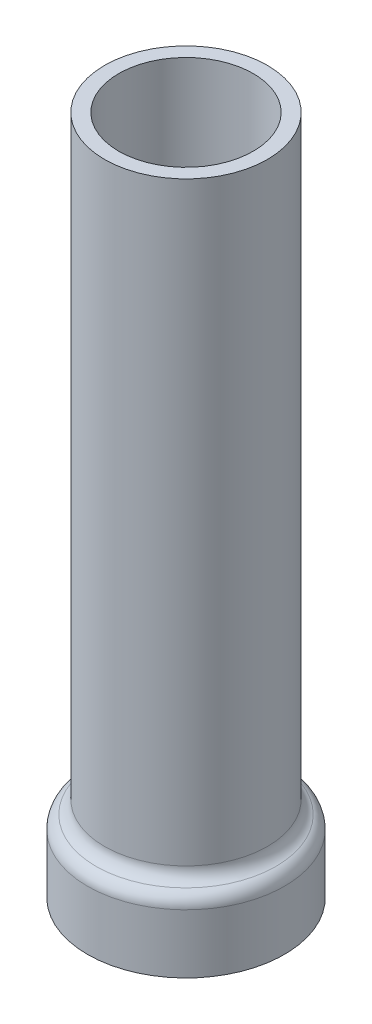
ISO-10303-21;
HEADER;
FILE_DESCRIPTION(('STEP AP214'),'2;1');
FILE_NAME('part.step','',(''),(''),'','','');
FILE_SCHEMA(('AUTOMOTIVE_DESIGN { 1 0 10303 214 1 1 1 1 }'));
ENDSEC;
DATA;
#1=APPLICATION_CONTEXT('core data for automotive mechanical design processes');
#2=APPLICATION_PROTOCOL_DEFINITION('international standard','automotive_design',2000,#1);
#3=PRODUCT_CONTEXT('',#1,'mechanical');
#4=PRODUCT('Part','Part','',(#3));
#5=PRODUCT_RELATED_PRODUCT_CATEGORY('part','',(#4));
#6=PRODUCT_DEFINITION_FORMATION('','',#4);
#7=PRODUCT_DEFINITION_CONTEXT('part definition',#1,'design');
#8=PRODUCT_DEFINITION('design','',#6,#7);
#9=PRODUCT_DEFINITION_SHAPE('','',#8);
#10=(LENGTH_UNIT() NAMED_UNIT(*) SI_UNIT(.MILLI.,.METRE.));
#11=(NAMED_UNIT(*) PLANE_ANGLE_UNIT() SI_UNIT($,.RADIAN.));
#12=(NAMED_UNIT(*) SI_UNIT($,.STERADIAN.) SOLID_ANGLE_UNIT());
#13=UNCERTAINTY_MEASURE_WITH_UNIT(LENGTH_MEASURE(1.E-05),#10,'distance_accuracy_value','');
#14=(GEOMETRIC_REPRESENTATION_CONTEXT(3) GLOBAL_UNCERTAINTY_ASSIGNED_CONTEXT((#13)) GLOBAL_UNIT_ASSIGNED_CONTEXT((#10,
#11,#12)) REPRESENTATION_CONTEXT('',''));
#15=CARTESIAN_POINT('',(0.,0.,0.));
#16=DIRECTION('',(0.,0.,1.));
#17=DIRECTION('',(1.,0.,0.));
#18=AXIS2_PLACEMENT_3D('',#15,#16,#17);
#19=CARTESIAN_POINT('',(0.,0.,0.));
#20=DIRECTION('',(0.,1.,0.));
#21=DIRECTION('',(0.,0.,1.));
#22=AXIS2_PLACEMENT_3D('',#19,#20,#21);
#23=PLANE('',#22);
#24=CARTESIAN_POINT('',(0.,0.,0.));
#25=DIRECTION('',(0.,1.,0.));
#26=DIRECTION('',(0.,0.,1.));
#27=AXIS2_PLACEMENT_3D('',#24,#25,#26);
#28=CIRCLE('',#27,17.653);
#29=CARTESIAN_POINT('',(0.,0.,17.653));
#30=VERTEX_POINT('',#29);
#31=EDGE_CURVE('E50',#30,#30,#28,.T.);
#32=ORIENTED_EDGE('',*,*,#31,.F.);
#33=EDGE_LOOP('',(#32));
#34=FACE_BOUND('',#33,.T.);
#35=CARTESIAN_POINT('',(0.,0.,0.));
#36=DIRECTION('',(0.,1.,0.));
#37=DIRECTION('',(0.,0.,1.));
#38=AXIS2_PLACEMENT_3D('',#35,#36,#37);
#39=CIRCLE('',#38,15.113);
#40=CARTESIAN_POINT('',(0.,0.,15.113));
#41=VERTEX_POINT('',#40);
#42=EDGE_CURVE('E55',#41,#41,#39,.T.);
#43=ORIENTED_EDGE('',*,*,#42,.T.);
#44=EDGE_LOOP('',(#43));
#45=FACE_BOUND('',#44,.T.);
#46=ADVANCED_FACE('F35',(#34,#45),#23,.F.);
#47=CARTESIAN_POINT('',(0.,6.35,0.));
#48=DIRECTION('',(0.,-1.,0.));
#49=DIRECTION('',(0.,0.,-1.));
#50=AXIS2_PLACEMENT_3D('',#47,#48,#49);
#51=CYLINDRICAL_SURFACE('',#50,17.653);
#52=CARTESIAN_POINT('',(0.,10.5841030939249,0.));
#53=DIRECTION('',(0.,-1.,0.));
#54=DIRECTION('',(0.,0.,-1.));
#55=AXIS2_PLACEMENT_3D('',#52,#53,#54);
#56=CIRCLE('',#55,17.653);
#57=CARTESIAN_POINT('',(0.,10.5841030939249,-17.653));
#58=VERTEX_POINT('',#57);
#59=EDGE_CURVE('E10',#58,#58,#56,.T.);
#60=ORIENTED_EDGE('',*,*,#59,.T.);
#61=EDGE_LOOP('',(#60));
#62=FACE_BOUND('',#61,.T.);
#63=ORIENTED_EDGE('',*,*,#31,.T.);
#64=EDGE_LOOP('',(#63));
#65=FACE_BOUND('',#64,.T.);
#66=ADVANCED_FACE('F89',(#62,#65),#51,.T.);
#67=CARTESIAN_POINT('',(0.,6.35,0.));
#68=DIRECTION('',(0.,-1.,0.));
#69=DIRECTION('',(0.,0.,-1.));
#70=AXIS2_PLACEMENT_3D('',#67,#68,#69);
#71=CYLINDRICAL_SURFACE('',#70,15.113);
#72=CARTESIAN_POINT('',(0.,6.35,0.));
#73=DIRECTION('',(0.,1.,0.));
#74=DIRECTION('',(0.,0.,1.));
#75=AXIS2_PLACEMENT_3D('',#72,#73,#74);
#76=CIRCLE('',#75,15.113);
#77=CARTESIAN_POINT('',(0.,6.35,15.113));
#78=VERTEX_POINT('',#77);
#79=EDGE_CURVE('E58',#78,#78,#76,.T.);
#80=ORIENTED_EDGE('',*,*,#79,.T.);
#81=EDGE_LOOP('',(#80));
#82=FACE_BOUND('',#81,.T.);
#83=ORIENTED_EDGE('',*,*,#42,.F.);
#84=EDGE_LOOP('',(#83));
#85=FACE_BOUND('',#84,.T.);
#86=ADVANCED_FACE('F95',(#82,#85),#71,.F.);
#87=CARTESIAN_POINT('',(0.,6.35,0.));
#88=DIRECTION('',(0.,1.,0.));
#89=DIRECTION('',(0.,0.,1.));
#90=AXIS2_PLACEMENT_3D('',#87,#88,#89);
#91=PLANE('',#90);
#92=CARTESIAN_POINT('',(0.,6.35,0.));
#93=DIRECTION('',(0.,1.,0.));
#94=DIRECTION('',(0.,0.,1.));
#95=AXIS2_PLACEMENT_3D('',#92,#93,#94);
#96=CIRCLE('',#95,12.065);
#97=CARTESIAN_POINT('',(0.,6.35,12.065));
#98=VERTEX_POINT('',#97);
#99=EDGE_CURVE('E61',#98,#98,#96,.T.);
#100=ORIENTED_EDGE('',*,*,#99,.T.);
#101=EDGE_LOOP('',(#100));
#102=FACE_BOUND('',#101,.T.);
#103=ORIENTED_EDGE('',*,*,#79,.F.);
#104=EDGE_LOOP('',(#103));
#105=FACE_BOUND('',#104,.T.);
#106=ADVANCED_FACE('F85',(#102,#105),#91,.F.);
#107=CARTESIAN_POINT('',(0.,12.7,0.));
#108=DIRECTION('',(0.,-1.,0.));
#109=DIRECTION('',(0.,0.,-1.));
#110=AXIS2_PLACEMENT_3D('',#107,#108,#109);
#111=CYLINDRICAL_SURFACE('',#110,12.065);
#112=ORIENTED_EDGE('',*,*,#99,.F.);
#113=EDGE_LOOP('',(#112));
#114=FACE_BOUND('',#113,.T.);
#115=CARTESIAN_POINT('',(0.,121.92,0.));
#116=DIRECTION('',(0.,1.,0.));
#117=DIRECTION('',(0.,0.,1.));
#118=AXIS2_PLACEMENT_3D('',#115,#116,#117);
#119=CIRCLE('',#118,12.065);
#120=CARTESIAN_POINT('',(0.,121.92,12.065));
#121=VERTEX_POINT('',#120);
#122=EDGE_CURVE('E67',#121,#121,#119,.T.);
#123=ORIENTED_EDGE('',*,*,#122,.T.);
#124=EDGE_LOOP('',(#123));
#125=FACE_BOUND('',#124,.T.);
#126=ADVANCED_FACE('F71',(#114,#125),#111,.F.);
#127=CARTESIAN_POINT('',(0.,121.92,0.));
#128=DIRECTION('',(0.,1.,0.));
#129=DIRECTION('',(0.,0.,1.));
#130=AXIS2_PLACEMENT_3D('',#127,#128,#129);
#131=PLANE('',#130);
#132=CARTESIAN_POINT('',(0.,121.92,0.));
#133=DIRECTION('',(0.,1.,0.));
#134=DIRECTION('',(0.,0.,1.));
#135=AXIS2_PLACEMENT_3D('',#132,#133,#134);
#136=CIRCLE('',#135,14.605);
#137=CARTESIAN_POINT('',(0.,121.92,14.605));
#138=VERTEX_POINT('',#137);
#139=EDGE_CURVE('E64',#138,#138,#136,.T.);
#140=ORIENTED_EDGE('',*,*,#139,.T.);
#141=EDGE_LOOP('',(#140));
#142=FACE_BOUND('',#141,.T.);
#143=ORIENTED_EDGE('',*,*,#122,.F.);
#144=EDGE_LOOP('',(#143));
#145=FACE_BOUND('',#144,.T.);
#146=ADVANCED_FACE('F73',(#142,#145),#131,.T.);
#147=CARTESIAN_POINT('',(0.,121.92,0.));
#148=DIRECTION('',(0.,-1.,0.));
#149=DIRECTION('',(0.,0.,-1.));
#150=AXIS2_PLACEMENT_3D('',#147,#148,#149);
#151=CYLINDRICAL_SURFACE('',#150,14.605);
#152=CARTESIAN_POINT('',(0.,15.24,0.));
#153=DIRECTION('',(0.,1.,0.));
#154=DIRECTION('',(0.,0.,1.));
#155=AXIS2_PLACEMENT_3D('',#152,#153,#154);
#156=CIRCLE('',#155,14.605);
#157=CARTESIAN_POINT('',(0.,15.24,14.605));
#158=VERTEX_POINT('',#157);
#159=EDGE_CURVE('E46',#158,#158,#156,.T.);
#160=ORIENTED_EDGE('',*,*,#159,.T.);
#161=EDGE_LOOP('',(#160));
#162=FACE_BOUND('',#161,.T.);
#163=ORIENTED_EDGE('',*,*,#139,.F.);
#164=EDGE_LOOP('',(#163));
#165=FACE_BOUND('',#164,.T.);
#166=ADVANCED_FACE('F75',(#162,#165),#151,.T.);
#167=CARTESIAN_POINT('',(0.,15.24,0.));
#168=DIRECTION('',(0.,1.,0.));
#169=DIRECTION('',(0.,0.,1.));
#170=AXIS2_PLACEMENT_3D('',#167,#168,#169);
#171=TOROIDAL_SURFACE('',#170,17.145,2.54);
#172=CARTESIAN_POINT('',(0.,12.9120515469623,0.));
#173=DIRECTION('',(0.,1.,0.));
#174=DIRECTION('',(0.,0.,1.));
#175=AXIS2_PLACEMENT_3D('',#172,#173,#174);
#176=CIRCLE('',#175,16.1289999999999);
#177=CARTESIAN_POINT('',(0.,12.9120515469623,16.1289999999999));
#178=VERTEX_POINT('',#177);
#179=EDGE_CURVE('E42',#178,#178,#176,.T.);
#180=ORIENTED_EDGE('',*,*,#179,.T.);
#181=EDGE_LOOP('',(#180));
#182=FACE_BOUND('',#181,.T.);
#183=ORIENTED_EDGE('',*,*,#159,.F.);
#184=EDGE_LOOP('',(#183));
#185=FACE_BOUND('',#184,.T.);
#186=ADVANCED_FACE('F82',(#182,#185),#171,.F.);
#187=CARTESIAN_POINT('',(0.,10.5841030939249,0.));
#188=DIRECTION('',(0.,-1.,0.));
#189=DIRECTION('',(0.,0.,-1.));
#190=AXIS2_PLACEMENT_3D('',#187,#188,#189);
#191=TOROIDAL_SURFACE('',#190,15.113,2.54);
#192=ORIENTED_EDGE('',*,*,#59,.F.);
#193=EDGE_LOOP('',(#192));
#194=FACE_BOUND('',#193,.T.);
#195=ORIENTED_EDGE('',*,*,#179,.F.);
#196=EDGE_LOOP('',(#195));
#197=FACE_BOUND('',#196,.T.);
#198=ADVANCED_FACE('F37',(#194,#197),#191,.T.);
#199=CLOSED_SHELL('',(#46,#66,#86,#106,#126,#146,#166,#186,#198));
#200=MANIFOLD_SOLID_BREP('B2',#199);
#201=ADVANCED_BREP_SHAPE_REPRESENTATION('',(#18,#200),#14);
#202=SHAPE_DEFINITION_REPRESENTATION(#9,#201);
ENDSEC;
END-ISO-10303-21;
